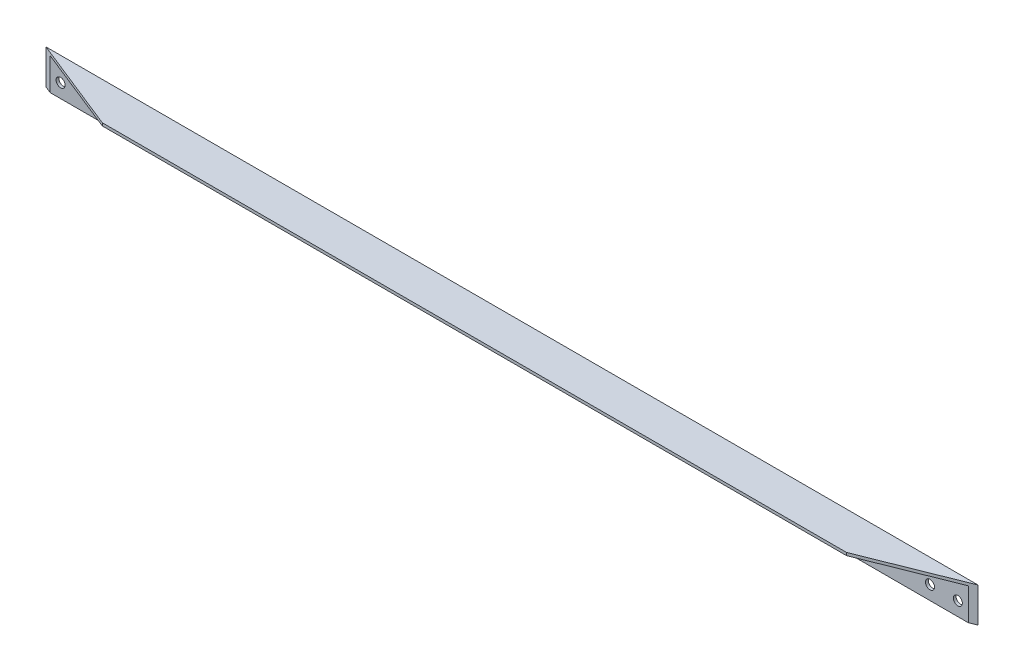
ISO-10303-21;
HEADER;
FILE_DESCRIPTION(('STEP AP214'),'2;1');
FILE_NAME('part.step','',(''),(''),'','','');
FILE_SCHEMA(('AUTOMOTIVE_DESIGN { 1 0 10303 214 1 1 1 1 }'));
ENDSEC;
DATA;
#1=APPLICATION_CONTEXT('core data for automotive mechanical design processes');
#2=APPLICATION_PROTOCOL_DEFINITION('international standard','automotive_design',2000,#1);
#3=PRODUCT_CONTEXT('',#1,'mechanical');
#4=PRODUCT('Part','Part','',(#3));
#5=PRODUCT_RELATED_PRODUCT_CATEGORY('part','',(#4));
#6=PRODUCT_DEFINITION_FORMATION('','',#4);
#7=PRODUCT_DEFINITION_CONTEXT('part definition',#1,'design');
#8=PRODUCT_DEFINITION('design','',#6,#7);
#9=PRODUCT_DEFINITION_SHAPE('','',#8);
#10=(LENGTH_UNIT() NAMED_UNIT(*) SI_UNIT(.MILLI.,.METRE.));
#11=(NAMED_UNIT(*) PLANE_ANGLE_UNIT() SI_UNIT($,.RADIAN.));
#12=(NAMED_UNIT(*) SI_UNIT($,.STERADIAN.) SOLID_ANGLE_UNIT());
#13=UNCERTAINTY_MEASURE_WITH_UNIT(LENGTH_MEASURE(1.E-05),#10,'distance_accuracy_value','');
#14=(GEOMETRIC_REPRESENTATION_CONTEXT(3) GLOBAL_UNCERTAINTY_ASSIGNED_CONTEXT((#13)) GLOBAL_UNIT_ASSIGNED_CONTEXT((#10,
#11,#12)) REPRESENTATION_CONTEXT('',''));
#15=CARTESIAN_POINT('',(0.,0.,0.));
#16=DIRECTION('',(0.,0.,1.));
#17=DIRECTION('',(1.,0.,0.));
#18=AXIS2_PLACEMENT_3D('',#15,#16,#17);
#19=CARTESIAN_POINT('',(-1340.,100.,8.));
#20=DIRECTION('',(0.,0.,-1.));
#21=DIRECTION('',(-1.,0.,0.));
#22=AXIS2_PLACEMENT_3D('',#19,#20,#21);
#23=PLANE('',#22);
#24=CARTESIAN_POINT('',(-1210.,40.,8.));
#25=DIRECTION('',(0.,0.,1.));
#26=DIRECTION('',(-1.,0.,0.));
#27=AXIS2_PLACEMENT_3D('',#24,#25,#26);
#28=CIRCLE('',#27,12.9999999999998);
#29=CARTESIAN_POINT('',(-1223.,40.,8.));
#30=VERTEX_POINT('',#29);
#31=EDGE_CURVE('E153',#30,#30,#28,.T.);
#32=ORIENTED_EDGE('',*,*,#31,.F.);
#33=EDGE_LOOP('',(#32));
#34=FACE_BOUND('',#33,.T.);
#35=CARTESIAN_POINT('',(-1290.,40.,8.));
#36=DIRECTION('',(0.,0.,1.));
#37=DIRECTION('',(-1.,0.,0.));
#38=AXIS2_PLACEMENT_3D('',#35,#36,#37);
#39=CIRCLE('',#38,12.9999999999998);
#40=CARTESIAN_POINT('',(-1303.,40.,8.));
#41=VERTEX_POINT('',#40);
#42=EDGE_CURVE('E147',#41,#41,#39,.T.);
#43=ORIENTED_EDGE('',*,*,#42,.F.);
#44=EDGE_LOOP('',(#43));
#45=FACE_BOUND('',#44,.T.);
#46=CARTESIAN_POINT('',(-100.,39.9999999999999,8.));
#47=DIRECTION('',(0.,0.,1.));
#48=DIRECTION('',(-1.,0.,0.));
#49=AXIS2_PLACEMENT_3D('',#46,#47,#48);
#50=CIRCLE('',#49,13.);
#51=CARTESIAN_POINT('',(-113.,39.9999999999999,8.));
#52=VERTEX_POINT('',#51);
#53=EDGE_CURVE('E141',#52,#52,#50,.T.);
#54=ORIENTED_EDGE('',*,*,#53,.F.);
#55=EDGE_LOOP('',(#54));
#56=FACE_BOUND('',#55,.T.);
#57=CARTESIAN_POINT('',(100.,39.9999999999999,8.));
#58=DIRECTION('',(0.,0.,1.));
#59=DIRECTION('',(1.,0.,0.));
#60=AXIS2_PLACEMENT_3D('',#57,#58,#59);
#61=CIRCLE('',#60,13.);
#62=CARTESIAN_POINT('',(113.,39.9999999999999,8.));
#63=VERTEX_POINT('',#62);
#64=EDGE_CURVE('E135',#63,#63,#61,.T.);
#65=ORIENTED_EDGE('',*,*,#64,.F.);
#66=EDGE_LOOP('',(#65));
#67=FACE_BOUND('',#66,.T.);
#68=CARTESIAN_POINT('',(0.,39.9999999999999,8.));
#69=DIRECTION('',(0.,0.,1.));
#70=DIRECTION('',(1.,0.,0.));
#71=AXIS2_PLACEMENT_3D('',#68,#69,#70);
#72=CIRCLE('',#71,13.);
#73=CARTESIAN_POINT('',(13.,39.9999999999999,8.));
#74=VERTEX_POINT('',#73);
#75=EDGE_CURVE('E129',#74,#74,#72,.T.);
#76=ORIENTED_EDGE('',*,*,#75,.F.);
#77=EDGE_LOOP('',(#76));
#78=FACE_BOUND('',#77,.T.);
#79=CARTESIAN_POINT('',(1210.,40.,8.));
#80=DIRECTION('',(0.,0.,1.));
#81=DIRECTION('',(1.,0.,0.));
#82=AXIS2_PLACEMENT_3D('',#79,#80,#81);
#83=CIRCLE('',#82,12.9999999999998);
#84=CARTESIAN_POINT('',(1223.,40.,8.));
#85=VERTEX_POINT('',#84);
#86=EDGE_CURVE('E123',#85,#85,#83,.T.);
#87=ORIENTED_EDGE('',*,*,#86,.F.);
#88=EDGE_LOOP('',(#87));
#89=FACE_BOUND('',#88,.T.);
#90=CARTESIAN_POINT('',(1290.,40.,8.));
#91=DIRECTION('',(0.,0.,1.));
#92=DIRECTION('',(1.,0.,0.));
#93=AXIS2_PLACEMENT_3D('',#90,#91,#92);
#94=CIRCLE('',#93,12.9999999999998);
#95=CARTESIAN_POINT('',(1303.,40.,8.));
#96=VERTEX_POINT('',#95);
#97=EDGE_CURVE('E97',#96,#96,#94,.T.);
#98=ORIENTED_EDGE('',*,*,#97,.F.);
#99=EDGE_LOOP('',(#98));
#100=FACE_BOUND('',#99,.T.);
#101=DIRECTION('',(1.,0.,0.));
#102=VECTOR('',#101,1.);
#103=CARTESIAN_POINT('',(-1340.,92.,8.));
#104=LINE('',#103,#102);
#105=CARTESIAN_POINT('',(-1320.,92.,8.));
#106=VERTEX_POINT('',#105);
#107=CARTESIAN_POINT('',(1320.,92.,8.00000000000012));
#108=VERTEX_POINT('',#107);
#109=EDGE_CURVE('E162',#106,#108,#104,.T.);
#110=ORIENTED_EDGE('',*,*,#109,.F.);
#111=DIRECTION('',(0.,-1.,0.));
#112=VECTOR('',#111,1.);
#113=CARTESIAN_POINT('',(-1320.,100.,8.));
#114=LINE('',#113,#112);
#115=CARTESIAN_POINT('',(-1320.,0.,8.00000000000001));
#116=VERTEX_POINT('',#115);
#117=EDGE_CURVE('E174',#106,#116,#114,.T.);
#118=ORIENTED_EDGE('',*,*,#117,.T.);
#119=DIRECTION('',(1.,0.,0.));
#120=VECTOR('',#119,1.);
#121=CARTESIAN_POINT('',(-1340.,0.,8.));
#122=LINE('',#121,#120);
#123=CARTESIAN_POINT('',(1320.,0.,8.00000000000002));
#124=VERTEX_POINT('',#123);
#125=EDGE_CURVE('E104',#116,#124,#122,.T.);
#126=ORIENTED_EDGE('',*,*,#125,.T.);
#127=DIRECTION('',(0.,1.,0.));
#128=VECTOR('',#127,1.);
#129=CARTESIAN_POINT('',(1320.,100.,8.));
#130=LINE('',#129,#128);
#131=EDGE_CURVE('E165',#124,#108,#130,.T.);
#132=ORIENTED_EDGE('',*,*,#131,.T.);
#133=EDGE_LOOP('',(#110,#118,#126,#132));
#134=FACE_BOUND('',#133,.T.);
#135=ADVANCED_FACE('F34',(#34,#45,#56,#67,#78,#89,#100,#134),#23,.F.);
#136=CARTESIAN_POINT('',(-1340.,100.,0.));
#137=DIRECTION('',(0.,0.,-1.));
#138=DIRECTION('',(-1.,0.,0.));
#139=AXIS2_PLACEMENT_3D('',#136,#137,#138);
#140=PLANE('',#139);
#141=CARTESIAN_POINT('',(-1290.,40.,0.));
#142=DIRECTION('',(0.,0.,1.));
#143=DIRECTION('',(-1.,0.,0.));
#144=AXIS2_PLACEMENT_3D('',#141,#142,#143);
#145=CIRCLE('',#144,12.9999999999998);
#146=CARTESIAN_POINT('',(-1303.,40.,0.));
#147=VERTEX_POINT('',#146);
#148=EDGE_CURVE('E150',#147,#147,#145,.T.);
#149=ORIENTED_EDGE('',*,*,#148,.T.);
#150=EDGE_LOOP('',(#149));
#151=FACE_BOUND('',#150,.T.);
#152=CARTESIAN_POINT('',(100.,39.9999999999999,0.));
#153=DIRECTION('',(0.,0.,1.));
#154=DIRECTION('',(1.,0.,0.));
#155=AXIS2_PLACEMENT_3D('',#152,#153,#154);
#156=CIRCLE('',#155,13.);
#157=CARTESIAN_POINT('',(113.,39.9999999999999,0.));
#158=VERTEX_POINT('',#157);
#159=EDGE_CURVE('E138',#158,#158,#156,.T.);
#160=ORIENTED_EDGE('',*,*,#159,.T.);
#161=EDGE_LOOP('',(#160));
#162=FACE_BOUND('',#161,.T.);
#163=CARTESIAN_POINT('',(1210.,40.,0.));
#164=DIRECTION('',(0.,0.,1.));
#165=DIRECTION('',(1.,0.,0.));
#166=AXIS2_PLACEMENT_3D('',#163,#164,#165);
#167=CIRCLE('',#166,12.9999999999998);
#168=CARTESIAN_POINT('',(1223.,40.,0.));
#169=VERTEX_POINT('',#168);
#170=EDGE_CURVE('E126',#169,#169,#167,.T.);
#171=ORIENTED_EDGE('',*,*,#170,.T.);
#172=EDGE_LOOP('',(#171));
#173=FACE_BOUND('',#172,.T.);
#174=DIRECTION('',(0.,-1.,0.));
#175=VECTOR('',#174,1.);
#176=CARTESIAN_POINT('',(-1340.,0.,0.));
#177=LINE('',#176,#175);
#178=CARTESIAN_POINT('',(-1340.,100.,0.));
#179=VERTEX_POINT('',#178);
#180=CARTESIAN_POINT('',(-1340.,0.,0.));
#181=VERTEX_POINT('',#180);
#182=EDGE_CURVE('E85',#179,#181,#177,.T.);
#183=ORIENTED_EDGE('',*,*,#182,.F.);
#184=DIRECTION('',(-1.,0.,0.));
#185=VECTOR('',#184,1.);
#186=CARTESIAN_POINT('',(-1340.,100.,0.));
#187=LINE('',#186,#185);
#188=CARTESIAN_POINT('',(1340.,100.,0.));
#189=VERTEX_POINT('',#188);
#190=EDGE_CURVE('E110',#189,#179,#187,.T.);
#191=ORIENTED_EDGE('',*,*,#190,.F.);
#192=DIRECTION('',(0.,1.,0.));
#193=VECTOR('',#192,1.);
#194=CARTESIAN_POINT('',(1340.,0.,0.));
#195=LINE('',#194,#193);
#196=CARTESIAN_POINT('',(1340.,0.,0.));
#197=VERTEX_POINT('',#196);
#198=EDGE_CURVE('E108',#197,#189,#195,.T.);
#199=ORIENTED_EDGE('',*,*,#198,.F.);
#200=DIRECTION('',(1.,0.,0.));
#201=VECTOR('',#200,1.);
#202=CARTESIAN_POINT('',(-1340.,0.,0.));
#203=LINE('',#202,#201);
#204=EDGE_CURVE('E96',#181,#197,#203,.T.);
#205=ORIENTED_EDGE('',*,*,#204,.F.);
#206=EDGE_LOOP('',(#183,#191,#199,#205));
#207=FACE_BOUND('',#206,.T.);
#208=CARTESIAN_POINT('',(1290.,40.,0.));
#209=DIRECTION('',(0.,0.,1.));
#210=DIRECTION('',(1.,0.,0.));
#211=AXIS2_PLACEMENT_3D('',#208,#209,#210);
#212=CIRCLE('',#211,12.9999999999998);
#213=CARTESIAN_POINT('',(1303.,40.,0.));
#214=VERTEX_POINT('',#213);
#215=EDGE_CURVE('E120',#214,#214,#212,.T.);
#216=ORIENTED_EDGE('',*,*,#215,.T.);
#217=EDGE_LOOP('',(#216));
#218=FACE_BOUND('',#217,.T.);
#219=CARTESIAN_POINT('',(0.,39.9999999999999,0.));
#220=DIRECTION('',(0.,0.,1.));
#221=DIRECTION('',(1.,0.,0.));
#222=AXIS2_PLACEMENT_3D('',#219,#220,#221);
#223=CIRCLE('',#222,13.);
#224=CARTESIAN_POINT('',(13.,39.9999999999999,0.));
#225=VERTEX_POINT('',#224);
#226=EDGE_CURVE('E132',#225,#225,#223,.T.);
#227=ORIENTED_EDGE('',*,*,#226,.T.);
#228=EDGE_LOOP('',(#227));
#229=FACE_BOUND('',#228,.T.);
#230=CARTESIAN_POINT('',(-100.,39.9999999999999,0.));
#231=DIRECTION('',(0.,0.,1.));
#232=DIRECTION('',(-1.,0.,0.));
#233=AXIS2_PLACEMENT_3D('',#230,#231,#232);
#234=CIRCLE('',#233,13.);
#235=CARTESIAN_POINT('',(-113.,39.9999999999999,0.));
#236=VERTEX_POINT('',#235);
#237=EDGE_CURVE('E144',#236,#236,#234,.T.);
#238=ORIENTED_EDGE('',*,*,#237,.T.);
#239=EDGE_LOOP('',(#238));
#240=FACE_BOUND('',#239,.T.);
#241=CARTESIAN_POINT('',(-1210.,40.,0.));
#242=DIRECTION('',(0.,0.,1.));
#243=DIRECTION('',(-1.,0.,0.));
#244=AXIS2_PLACEMENT_3D('',#241,#242,#243);
#245=CIRCLE('',#244,12.9999999999998);
#246=CARTESIAN_POINT('',(-1223.,40.,0.));
#247=VERTEX_POINT('',#246);
#248=EDGE_CURVE('E156',#247,#247,#245,.T.);
#249=ORIENTED_EDGE('',*,*,#248,.T.);
#250=EDGE_LOOP('',(#249));
#251=FACE_BOUND('',#250,.T.);
#252=ADVANCED_FACE('F106',(#151,#162,#173,#207,#218,#229,#240,#251),#140,.T.);
#253=CARTESIAN_POINT('',(-1340.,0.,8.));
#254=DIRECTION('',(0.,1.,0.));
#255=DIRECTION('',(0.,0.,1.));
#256=AXIS2_PLACEMENT_3D('',#253,#254,#255);
#257=PLANE('',#256);
#258=ORIENTED_EDGE('',*,*,#125,.F.);
#259=DIRECTION('',(-0.928476690885259,0.,-0.371390676354104));
#260=VECTOR('',#259,1.);
#261=CARTESIAN_POINT('',(-1340.,0.,0.));
#262=LINE('',#261,#260);
#263=EDGE_CURVE('E88',#116,#181,#262,.T.);
#264=ORIENTED_EDGE('',*,*,#263,.T.);
#265=ORIENTED_EDGE('',*,*,#204,.T.);
#266=DIRECTION('',(-0.928476690885259,0.,0.371390676354104));
#267=VECTOR('',#266,1.);
#268=CARTESIAN_POINT('',(1340.,0.,0.));
#269=LINE('',#268,#267);
#270=EDGE_CURVE('E172',#197,#124,#269,.T.);
#271=ORIENTED_EDGE('',*,*,#270,.T.);
#272=EDGE_LOOP('',(#258,#264,#265,#271));
#273=FACE_BOUND('',#272,.T.);
#274=ADVANCED_FACE('F36',(#273),#257,.F.);
#275=CARTESIAN_POINT('',(-1340.,100.,8.));
#276=DIRECTION('',(0.,-1.,0.));
#277=DIRECTION('',(0.,0.,-1.));
#278=AXIS2_PLACEMENT_3D('',#275,#276,#277);
#279=PLANE('',#278);
#280=ORIENTED_EDGE('',*,*,#190,.T.);
#281=DIRECTION('',(-0.928476690885259,0.,-0.371390676354104));
#282=VECTOR('',#281,1.);
#283=CARTESIAN_POINT('',(-1340.,100.,0.));
#284=LINE('',#283,#282);
#285=CARTESIAN_POINT('',(-1070.,100.,108.));
#286=VERTEX_POINT('',#285);
#287=EDGE_CURVE('E91',#286,#179,#284,.T.);
#288=ORIENTED_EDGE('',*,*,#287,.F.);
#289=DIRECTION('',(-1.,0.,0.));
#290=VECTOR('',#289,1.);
#291=CARTESIAN_POINT('',(-1340.,100.,108.));
#292=LINE('',#291,#290);
#293=CARTESIAN_POINT('',(1070.,100.,108.));
#294=VERTEX_POINT('',#293);
#295=EDGE_CURVE('E159',#294,#286,#292,.T.);
#296=ORIENTED_EDGE('',*,*,#295,.F.);
#297=DIRECTION('',(-0.928476690885259,0.,0.371390676354104));
#298=VECTOR('',#297,1.);
#299=CARTESIAN_POINT('',(1340.,100.,0.));
#300=LINE('',#299,#298);
#301=EDGE_CURVE('E56',#189,#294,#300,.T.);
#302=ORIENTED_EDGE('',*,*,#301,.F.);
#303=EDGE_LOOP('',(#280,#288,#296,#302));
#304=FACE_BOUND('',#303,.T.);
#305=ADVANCED_FACE('F185',(#304),#279,.F.);
#306=CARTESIAN_POINT('',(1290.,40.,8.));
#307=DIRECTION('',(0.,0.,-1.));
#308=DIRECTION('',(-1.,0.,0.));
#309=AXIS2_PLACEMENT_3D('',#306,#307,#308);
#310=CYLINDRICAL_SURFACE('',#309,12.9999999999998);
#311=ORIENTED_EDGE('',*,*,#97,.T.);
#312=EDGE_LOOP('',(#311));
#313=FACE_BOUND('',#312,.T.);
#314=ORIENTED_EDGE('',*,*,#215,.F.);
#315=EDGE_LOOP('',(#314));
#316=FACE_BOUND('',#315,.T.);
#317=ADVANCED_FACE('F208',(#313,#316),#310,.F.);
#318=CARTESIAN_POINT('',(1210.,40.,8.));
#319=DIRECTION('',(0.,0.,-1.));
#320=DIRECTION('',(-1.,0.,0.));
#321=AXIS2_PLACEMENT_3D('',#318,#319,#320);
#322=CYLINDRICAL_SURFACE('',#321,12.9999999999998);
#323=ORIENTED_EDGE('',*,*,#86,.T.);
#324=EDGE_LOOP('',(#323));
#325=FACE_BOUND('',#324,.T.);
#326=ORIENTED_EDGE('',*,*,#170,.F.);
#327=EDGE_LOOP('',(#326));
#328=FACE_BOUND('',#327,.T.);
#329=ADVANCED_FACE('F215',(#325,#328),#322,.F.);
#330=CARTESIAN_POINT('',(0.,39.9999999999999,8.));
#331=DIRECTION('',(0.,0.,-1.));
#332=DIRECTION('',(-1.,0.,0.));
#333=AXIS2_PLACEMENT_3D('',#330,#331,#332);
#334=CYLINDRICAL_SURFACE('',#333,13.);
#335=ORIENTED_EDGE('',*,*,#75,.T.);
#336=EDGE_LOOP('',(#335));
#337=FACE_BOUND('',#336,.T.);
#338=ORIENTED_EDGE('',*,*,#226,.F.);
#339=EDGE_LOOP('',(#338));
#340=FACE_BOUND('',#339,.T.);
#341=ADVANCED_FACE('F267',(#337,#340),#334,.F.);
#342=CARTESIAN_POINT('',(100.,39.9999999999999,8.));
#343=DIRECTION('',(0.,0.,-1.));
#344=DIRECTION('',(-1.,0.,0.));
#345=AXIS2_PLACEMENT_3D('',#342,#343,#344);
#346=CYLINDRICAL_SURFACE('',#345,13.);
#347=ORIENTED_EDGE('',*,*,#64,.T.);
#348=EDGE_LOOP('',(#347));
#349=FACE_BOUND('',#348,.T.);
#350=ORIENTED_EDGE('',*,*,#159,.F.);
#351=EDGE_LOOP('',(#350));
#352=FACE_BOUND('',#351,.T.);
#353=ADVANCED_FACE('F257',(#349,#352),#346,.F.);
#354=CARTESIAN_POINT('',(-100.,39.9999999999999,8.));
#355=DIRECTION('',(0.,0.,-1.));
#356=DIRECTION('',(-1.,0.,0.));
#357=AXIS2_PLACEMENT_3D('',#354,#355,#356);
#358=CYLINDRICAL_SURFACE('',#357,13.);
#359=ORIENTED_EDGE('',*,*,#53,.T.);
#360=EDGE_LOOP('',(#359));
#361=FACE_BOUND('',#360,.T.);
#362=ORIENTED_EDGE('',*,*,#237,.F.);
#363=EDGE_LOOP('',(#362));
#364=FACE_BOUND('',#363,.T.);
#365=ADVANCED_FACE('F247',(#361,#364),#358,.F.);
#366=CARTESIAN_POINT('',(-1290.,40.,8.));
#367=DIRECTION('',(0.,0.,-1.));
#368=DIRECTION('',(-1.,0.,0.));
#369=AXIS2_PLACEMENT_3D('',#366,#367,#368);
#370=CYLINDRICAL_SURFACE('',#369,12.9999999999998);
#371=ORIENTED_EDGE('',*,*,#42,.T.);
#372=EDGE_LOOP('',(#371));
#373=FACE_BOUND('',#372,.T.);
#374=ORIENTED_EDGE('',*,*,#148,.F.);
#375=EDGE_LOOP('',(#374));
#376=FACE_BOUND('',#375,.T.);
#377=ADVANCED_FACE('F237',(#373,#376),#370,.F.);
#378=CARTESIAN_POINT('',(-1210.,40.,8.));
#379=DIRECTION('',(0.,0.,-1.));
#380=DIRECTION('',(-1.,0.,0.));
#381=AXIS2_PLACEMENT_3D('',#378,#379,#380);
#382=CYLINDRICAL_SURFACE('',#381,12.9999999999998);
#383=ORIENTED_EDGE('',*,*,#31,.T.);
#384=EDGE_LOOP('',(#383));
#385=FACE_BOUND('',#384,.T.);
#386=ORIENTED_EDGE('',*,*,#248,.F.);
#387=EDGE_LOOP('',(#386));
#388=FACE_BOUND('',#387,.T.);
#389=ADVANCED_FACE('F195',(#385,#388),#382,.F.);
#390=CARTESIAN_POINT('',(-1340.,92.,108.));
#391=DIRECTION('',(0.,1.,0.));
#392=DIRECTION('',(0.,0.,1.));
#393=AXIS2_PLACEMENT_3D('',#390,#391,#392);
#394=PLANE('',#393);
#395=DIRECTION('',(1.,0.,0.));
#396=VECTOR('',#395,1.);
#397=CARTESIAN_POINT('',(-1340.,92.,108.));
#398=LINE('',#397,#396);
#399=CARTESIAN_POINT('',(-1070.,92.,108.));
#400=VERTEX_POINT('',#399);
#401=CARTESIAN_POINT('',(1070.,92.,108.));
#402=VERTEX_POINT('',#401);
#403=EDGE_CURVE('E164',#400,#402,#398,.T.);
#404=ORIENTED_EDGE('',*,*,#403,.F.);
#405=DIRECTION('',(-0.928476690885259,0.,-0.371390676354104));
#406=VECTOR('',#405,1.);
#407=CARTESIAN_POINT('',(-1302.75862068966,92.,14.8965517241379));
#408=LINE('',#407,#406);
#409=EDGE_CURVE('E48',#400,#106,#408,.T.);
#410=ORIENTED_EDGE('',*,*,#409,.T.);
#411=ORIENTED_EDGE('',*,*,#109,.T.);
#412=DIRECTION('',(-0.928476690885259,0.,0.371390676354104));
#413=VECTOR('',#412,1.);
#414=CARTESIAN_POINT('',(-1007.58620689655,92.,939.034482758621));
#415=LINE('',#414,#413);
#416=EDGE_CURVE('E170',#108,#402,#415,.T.);
#417=ORIENTED_EDGE('',*,*,#416,.T.);
#418=EDGE_LOOP('',(#404,#410,#411,#417));
#419=FACE_BOUND('',#418,.T.);
#420=ADVANCED_FACE('F181',(#419),#394,.F.);
#421=CARTESIAN_POINT('',(-1340.,92.,108.));
#422=DIRECTION('',(0.,0.,1.));
#423=DIRECTION('',(1.,0.,0.));
#424=AXIS2_PLACEMENT_3D('',#421,#422,#423);
#425=PLANE('',#424);
#426=DIRECTION('',(0.,1.,0.));
#427=VECTOR('',#426,1.);
#428=CARTESIAN_POINT('',(-1070.,92.,108.));
#429=LINE('',#428,#427);
#430=EDGE_CURVE('E11',#400,#286,#429,.T.);
#431=ORIENTED_EDGE('',*,*,#430,.F.);
#432=ORIENTED_EDGE('',*,*,#403,.T.);
#433=DIRECTION('',(0.,-1.,0.));
#434=VECTOR('',#433,1.);
#435=CARTESIAN_POINT('',(1070.,92.,108.));
#436=LINE('',#435,#434);
#437=EDGE_CURVE('E42',#294,#402,#436,.T.);
#438=ORIENTED_EDGE('',*,*,#437,.F.);
#439=ORIENTED_EDGE('',*,*,#295,.T.);
#440=EDGE_LOOP('',(#431,#432,#438,#439));
#441=FACE_BOUND('',#440,.T.);
#442=ADVANCED_FACE('F187',(#441),#425,.T.);
#443=CARTESIAN_POINT('',(1340.,0.,0.));
#444=DIRECTION('',(-0.371390676354104,0.,-0.928476690885259));
#445=DIRECTION('',(-0.928476690885259,0.,0.371390676354104));
#446=AXIS2_PLACEMENT_3D('',#443,#444,#445);
#447=PLANE('',#446);
#448=ORIENTED_EDGE('',*,*,#270,.F.);
#449=ORIENTED_EDGE('',*,*,#198,.T.);
#450=ORIENTED_EDGE('',*,*,#301,.T.);
#451=ORIENTED_EDGE('',*,*,#437,.T.);
#452=ORIENTED_EDGE('',*,*,#416,.F.);
#453=ORIENTED_EDGE('',*,*,#131,.F.);
#454=EDGE_LOOP('',(#448,#449,#450,#451,#452,#453));
#455=FACE_BOUND('',#454,.T.);
#456=ADVANCED_FACE('F182',(#455),#447,.F.);
#457=CARTESIAN_POINT('',(-1340.,0.,0.));
#458=DIRECTION('',(0.371390676354104,0.,-0.928476690885259));
#459=DIRECTION('',(-0.928476690885259,0.,-0.371390676354104));
#460=AXIS2_PLACEMENT_3D('',#457,#458,#459);
#461=PLANE('',#460);
#462=ORIENTED_EDGE('',*,*,#409,.F.);
#463=ORIENTED_EDGE('',*,*,#430,.T.);
#464=ORIENTED_EDGE('',*,*,#287,.T.);
#465=ORIENTED_EDGE('',*,*,#182,.T.);
#466=ORIENTED_EDGE('',*,*,#263,.F.);
#467=ORIENTED_EDGE('',*,*,#117,.F.);
#468=EDGE_LOOP('',(#462,#463,#464,#465,#466,#467));
#469=FACE_BOUND('',#468,.T.);
#470=ADVANCED_FACE('F87',(#469),#461,.F.);
#471=CLOSED_SHELL('',(#135,#252,#274,#305,#317,#329,#341,#353,#365,#377,#389,#420,#442,#456,#470));
#472=MANIFOLD_SOLID_BREP('B2',#471);
#473=ADVANCED_BREP_SHAPE_REPRESENTATION('',(#18,#472),#14);
#474=SHAPE_DEFINITION_REPRESENTATION(#9,#473);
ENDSEC;
END-ISO-10303-21;
